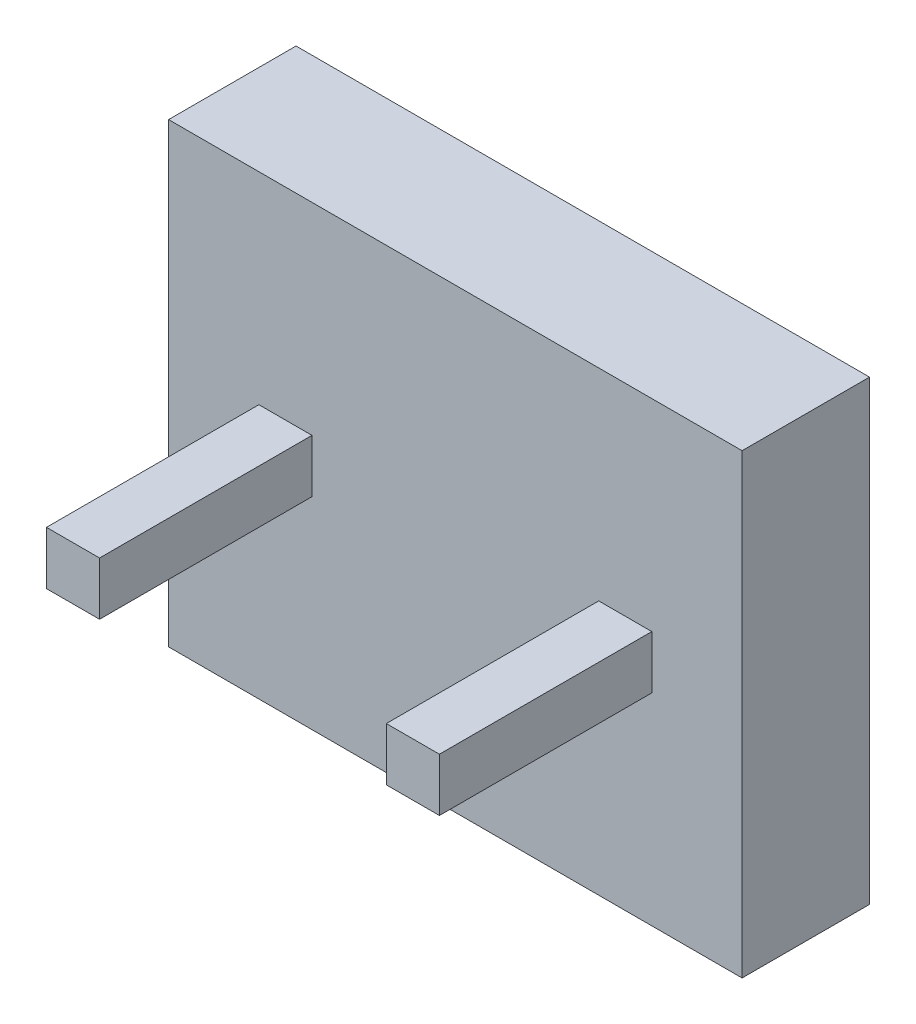
ISO-10303-21;
HEADER;
FILE_DESCRIPTION(('STEP AP214'),'2;1');
FILE_NAME('part.step','',(''),(''),'','','');
FILE_SCHEMA(('AUTOMOTIVE_DESIGN { 1 0 10303 214 1 1 1 1 }'));
ENDSEC;
DATA;
#1=APPLICATION_CONTEXT('core data for automotive mechanical design processes');
#2=APPLICATION_PROTOCOL_DEFINITION('international standard','automotive_design',2000,#1);
#3=PRODUCT_CONTEXT('',#1,'mechanical');
#4=PRODUCT('Part','Part','',(#3));
#5=PRODUCT_RELATED_PRODUCT_CATEGORY('part','',(#4));
#6=PRODUCT_DEFINITION_FORMATION('','',#4);
#7=PRODUCT_DEFINITION_CONTEXT('part definition',#1,'design');
#8=PRODUCT_DEFINITION('design','',#6,#7);
#9=PRODUCT_DEFINITION_SHAPE('','',#8);
#10=(LENGTH_UNIT() NAMED_UNIT(*) SI_UNIT(.MILLI.,.METRE.));
#11=(NAMED_UNIT(*) PLANE_ANGLE_UNIT() SI_UNIT($,.RADIAN.));
#12=(NAMED_UNIT(*) SI_UNIT($,.STERADIAN.) SOLID_ANGLE_UNIT());
#13=UNCERTAINTY_MEASURE_WITH_UNIT(LENGTH_MEASURE(1.E-05),#10,'distance_accuracy_value','');
#14=(GEOMETRIC_REPRESENTATION_CONTEXT(3) GLOBAL_UNCERTAINTY_ASSIGNED_CONTEXT((#13)) GLOBAL_UNIT_ASSIGNED_CONTEXT((#10,
#11,#12)) REPRESENTATION_CONTEXT('',''));
#15=CARTESIAN_POINT('',(0.,0.,0.));
#16=DIRECTION('',(0.,0.,1.));
#17=DIRECTION('',(1.,0.,0.));
#18=AXIS2_PLACEMENT_3D('',#15,#16,#17);
#19=CARTESIAN_POINT('',(-2.7,2.15,1.2));
#20=DIRECTION('',(1.,0.,0.));
#21=DIRECTION('',(0.,0.,-1.));
#22=AXIS2_PLACEMENT_3D('',#19,#20,#21);
#23=PLANE('',#22);
#24=DIRECTION('',(0.,-1.,0.));
#25=VECTOR('',#24,1.);
#26=CARTESIAN_POINT('',(-2.7,2.15,0.));
#27=LINE('',#26,#25);
#28=CARTESIAN_POINT('',(-2.7,2.15,0.));
#29=VERTEX_POINT('',#28);
#30=CARTESIAN_POINT('',(-2.7,-2.15,0.));
#31=VERTEX_POINT('',#30);
#32=EDGE_CURVE('E154',#29,#31,#27,.T.);
#33=ORIENTED_EDGE('',*,*,#32,.T.);
#34=DIRECTION('',(0.,0.,-1.));
#35=VECTOR('',#34,1.);
#36=CARTESIAN_POINT('',(-2.7,-2.15,1.2));
#37=LINE('',#36,#35);
#38=CARTESIAN_POINT('',(-2.7,-2.15,1.2));
#39=VERTEX_POINT('',#38);
#40=EDGE_CURVE('E11',#39,#31,#37,.T.);
#41=ORIENTED_EDGE('',*,*,#40,.F.);
#42=DIRECTION('',(0.,-1.,0.));
#43=VECTOR('',#42,1.);
#44=CARTESIAN_POINT('',(-2.7,2.15,1.2));
#45=LINE('',#44,#43);
#46=CARTESIAN_POINT('',(-2.7,2.15,1.2));
#47=VERTEX_POINT('',#46);
#48=EDGE_CURVE('E197',#47,#39,#45,.T.);
#49=ORIENTED_EDGE('',*,*,#48,.F.);
#50=DIRECTION('',(0.,0.,-1.));
#51=VECTOR('',#50,1.);
#52=CARTESIAN_POINT('',(-2.7,2.15,1.2));
#53=LINE('',#52,#51);
#54=EDGE_CURVE('E206',#47,#29,#53,.T.);
#55=ORIENTED_EDGE('',*,*,#54,.T.);
#56=EDGE_LOOP('',(#33,#41,#49,#55));
#57=FACE_BOUND('',#56,.T.);
#58=ADVANCED_FACE('F50',(#57),#23,.F.);
#59=CARTESIAN_POINT('',(-2.7,-2.15,1.2));
#60=DIRECTION('',(0.,1.,0.));
#61=DIRECTION('',(0.,0.,1.));
#62=AXIS2_PLACEMENT_3D('',#59,#60,#61);
#63=PLANE('',#62);
#64=DIRECTION('',(1.,0.,0.));
#65=VECTOR('',#64,1.);
#66=CARTESIAN_POINT('',(-2.7,-2.15,0.));
#67=LINE('',#66,#65);
#68=CARTESIAN_POINT('',(2.7,-2.15,0.));
#69=VERTEX_POINT('',#68);
#70=EDGE_CURVE('E158',#31,#69,#67,.T.);
#71=ORIENTED_EDGE('',*,*,#70,.T.);
#72=DIRECTION('',(0.,0.,-1.));
#73=VECTOR('',#72,1.);
#74=CARTESIAN_POINT('',(2.7,-2.15,1.2));
#75=LINE('',#74,#73);
#76=CARTESIAN_POINT('',(2.7,-2.15,1.2));
#77=VERTEX_POINT('',#76);
#78=EDGE_CURVE('E53',#77,#69,#75,.T.);
#79=ORIENTED_EDGE('',*,*,#78,.F.);
#80=DIRECTION('',(1.,0.,0.));
#81=VECTOR('',#80,1.);
#82=CARTESIAN_POINT('',(-2.7,-2.15,1.2));
#83=LINE('',#82,#81);
#84=EDGE_CURVE('E199',#39,#77,#83,.T.);
#85=ORIENTED_EDGE('',*,*,#84,.F.);
#86=ORIENTED_EDGE('',*,*,#40,.T.);
#87=EDGE_LOOP('',(#71,#79,#85,#86));
#88=FACE_BOUND('',#87,.T.);
#89=ADVANCED_FACE('F240',(#88),#63,.F.);
#90=CARTESIAN_POINT('',(2.7,-2.15,1.2));
#91=DIRECTION('',(-1.,0.,0.));
#92=DIRECTION('',(0.,0.,1.));
#93=AXIS2_PLACEMENT_3D('',#90,#91,#92);
#94=PLANE('',#93);
#95=DIRECTION('',(0.,1.,0.));
#96=VECTOR('',#95,1.);
#97=CARTESIAN_POINT('',(2.7,-2.15,0.));
#98=LINE('',#97,#96);
#99=CARTESIAN_POINT('',(2.7,2.15,0.));
#100=VERTEX_POINT('',#99);
#101=EDGE_CURVE('E207',#69,#100,#98,.T.);
#102=ORIENTED_EDGE('',*,*,#101,.T.);
#103=DIRECTION('',(0.,0.,-1.));
#104=VECTOR('',#103,1.);
#105=CARTESIAN_POINT('',(2.7,2.15,1.2));
#106=LINE('',#105,#104);
#107=CARTESIAN_POINT('',(2.7,2.15,1.2));
#108=VERTEX_POINT('',#107);
#109=EDGE_CURVE('E212',#108,#100,#106,.T.);
#110=ORIENTED_EDGE('',*,*,#109,.F.);
#111=DIRECTION('',(0.,1.,0.));
#112=VECTOR('',#111,1.);
#113=CARTESIAN_POINT('',(2.7,-2.15,1.2));
#114=LINE('',#113,#112);
#115=EDGE_CURVE('E201',#77,#108,#114,.T.);
#116=ORIENTED_EDGE('',*,*,#115,.F.);
#117=ORIENTED_EDGE('',*,*,#78,.T.);
#118=EDGE_LOOP('',(#102,#110,#116,#117));
#119=FACE_BOUND('',#118,.T.);
#120=ADVANCED_FACE('F222',(#119),#94,.F.);
#121=CARTESIAN_POINT('',(2.7,2.15,1.2));
#122=DIRECTION('',(0.,-1.,0.));
#123=DIRECTION('',(0.,0.,-1.));
#124=AXIS2_PLACEMENT_3D('',#121,#122,#123);
#125=PLANE('',#124);
#126=DIRECTION('',(-1.,0.,0.));
#127=VECTOR('',#126,1.);
#128=CARTESIAN_POINT('',(2.7,2.15,0.));
#129=LINE('',#128,#127);
#130=EDGE_CURVE('E203',#100,#29,#129,.T.);
#131=ORIENTED_EDGE('',*,*,#130,.T.);
#132=ORIENTED_EDGE('',*,*,#54,.F.);
#133=DIRECTION('',(-1.,0.,0.));
#134=VECTOR('',#133,1.);
#135=CARTESIAN_POINT('',(2.7,2.15,1.2));
#136=LINE('',#135,#134);
#137=EDGE_CURVE('E202',#108,#47,#136,.T.);
#138=ORIENTED_EDGE('',*,*,#137,.F.);
#139=ORIENTED_EDGE('',*,*,#109,.T.);
#140=EDGE_LOOP('',(#131,#132,#138,#139));
#141=FACE_BOUND('',#140,.T.);
#142=ADVANCED_FACE('F229',(#141),#125,.F.);
#143=CARTESIAN_POINT('',(0.,0.,1.2));
#144=DIRECTION('',(0.,0.,1.));
#145=DIRECTION('',(1.,0.,0.));
#146=AXIS2_PLACEMENT_3D('',#143,#144,#145);
#147=PLANE('',#146);
#148=DIRECTION('',(0.,-1.,0.));
#149=VECTOR('',#148,1.);
#150=CARTESIAN_POINT('',(-1.85,0.25,1.2));
#151=LINE('',#150,#149);
#152=CARTESIAN_POINT('',(-1.85,0.25,1.2));
#153=VERTEX_POINT('',#152);
#154=CARTESIAN_POINT('',(-1.85,-0.25,1.2));
#155=VERTEX_POINT('',#154);
#156=EDGE_CURVE('E61',#153,#155,#151,.T.);
#157=ORIENTED_EDGE('',*,*,#156,.F.);
#158=DIRECTION('',(-1.,0.,0.));
#159=VECTOR('',#158,1.);
#160=CARTESIAN_POINT('',(-1.35,0.25,1.2));
#161=LINE('',#160,#159);
#162=CARTESIAN_POINT('',(-1.35,0.25,1.2));
#163=VERTEX_POINT('',#162);
#164=EDGE_CURVE('E64',#163,#153,#161,.T.);
#165=ORIENTED_EDGE('',*,*,#164,.F.);
#166=DIRECTION('',(0.,1.,0.));
#167=VECTOR('',#166,1.);
#168=CARTESIAN_POINT('',(-1.35,-0.25,1.2));
#169=LINE('',#168,#167);
#170=CARTESIAN_POINT('',(-1.35,-0.25,1.2));
#171=VERTEX_POINT('',#170);
#172=EDGE_CURVE('E423',#171,#163,#169,.T.);
#173=ORIENTED_EDGE('',*,*,#172,.F.);
#174=DIRECTION('',(1.,0.,0.));
#175=VECTOR('',#174,1.);
#176=CARTESIAN_POINT('',(-1.85,-0.25,1.2));
#177=LINE('',#176,#175);
#178=EDGE_CURVE('E430',#155,#171,#177,.T.);
#179=ORIENTED_EDGE('',*,*,#178,.F.);
#180=EDGE_LOOP('',(#157,#165,#173,#179));
#181=FACE_BOUND('',#180,.T.);
#182=DIRECTION('',(0.,-1.,0.));
#183=VECTOR('',#182,1.);
#184=CARTESIAN_POINT('',(1.35,0.25,1.2));
#185=LINE('',#184,#183);
#186=CARTESIAN_POINT('',(1.35,0.25,1.2));
#187=VERTEX_POINT('',#186);
#188=CARTESIAN_POINT('',(1.35,-0.25,1.2));
#189=VERTEX_POINT('',#188);
#190=EDGE_CURVE('E190',#187,#189,#185,.T.);
#191=ORIENTED_EDGE('',*,*,#190,.F.);
#192=DIRECTION('',(-1.,0.,0.));
#193=VECTOR('',#192,1.);
#194=CARTESIAN_POINT('',(1.85,0.25,1.2));
#195=LINE('',#194,#193);
#196=CARTESIAN_POINT('',(1.85,0.25,1.2));
#197=VERTEX_POINT('',#196);
#198=EDGE_CURVE('E180',#197,#187,#195,.T.);
#199=ORIENTED_EDGE('',*,*,#198,.F.);
#200=DIRECTION('',(0.,1.,0.));
#201=VECTOR('',#200,1.);
#202=CARTESIAN_POINT('',(1.85,-0.25,1.2));
#203=LINE('',#202,#201);
#204=CARTESIAN_POINT('',(1.85,-0.25,1.2));
#205=VERTEX_POINT('',#204);
#206=EDGE_CURVE('E178',#205,#197,#203,.T.);
#207=ORIENTED_EDGE('',*,*,#206,.F.);
#208=DIRECTION('',(1.,0.,0.));
#209=VECTOR('',#208,1.);
#210=CARTESIAN_POINT('',(1.35,-0.25,1.2));
#211=LINE('',#210,#209);
#212=EDGE_CURVE('E184',#189,#205,#211,.T.);
#213=ORIENTED_EDGE('',*,*,#212,.F.);
#214=EDGE_LOOP('',(#191,#199,#207,#213));
#215=FACE_BOUND('',#214,.T.);
#216=ORIENTED_EDGE('',*,*,#48,.T.);
#217=ORIENTED_EDGE('',*,*,#84,.T.);
#218=ORIENTED_EDGE('',*,*,#115,.T.);
#219=ORIENTED_EDGE('',*,*,#137,.T.);
#220=EDGE_LOOP('',(#216,#217,#218,#219));
#221=FACE_BOUND('',#220,.T.);
#222=ADVANCED_FACE('F237',(#181,#215,#221),#147,.T.);
#223=CARTESIAN_POINT('',(0.,0.,0.));
#224=DIRECTION('',(0.,0.,1.));
#225=DIRECTION('',(1.,0.,0.));
#226=AXIS2_PLACEMENT_3D('',#223,#224,#225);
#227=PLANE('',#226);
#228=ORIENTED_EDGE('',*,*,#32,.F.);
#229=ORIENTED_EDGE('',*,*,#130,.F.);
#230=ORIENTED_EDGE('',*,*,#101,.F.);
#231=ORIENTED_EDGE('',*,*,#70,.F.);
#232=EDGE_LOOP('',(#228,#229,#230,#231));
#233=FACE_BOUND('',#232,.T.);
#234=ADVANCED_FACE('F230',(#233),#227,.F.);
#235=CARTESIAN_POINT('',(1.35,0.25,3.2));
#236=DIRECTION('',(1.,0.,0.));
#237=DIRECTION('',(0.,0.,-1.));
#238=AXIS2_PLACEMENT_3D('',#235,#236,#237);
#239=PLANE('',#238);
#240=ORIENTED_EDGE('',*,*,#190,.T.);
#241=DIRECTION('',(0.,0.,-1.));
#242=VECTOR('',#241,1.);
#243=CARTESIAN_POINT('',(1.35,-0.25,3.2));
#244=LINE('',#243,#242);
#245=CARTESIAN_POINT('',(1.35,-0.25,3.2));
#246=VERTEX_POINT('',#245);
#247=EDGE_CURVE('E163',#246,#189,#244,.T.);
#248=ORIENTED_EDGE('',*,*,#247,.F.);
#249=DIRECTION('',(0.,-1.,0.));
#250=VECTOR('',#249,1.);
#251=CARTESIAN_POINT('',(1.35,0.25,3.2));
#252=LINE('',#251,#250);
#253=CARTESIAN_POINT('',(1.35,0.25,3.2));
#254=VERTEX_POINT('',#253);
#255=EDGE_CURVE('E182',#254,#246,#252,.T.);
#256=ORIENTED_EDGE('',*,*,#255,.F.);
#257=DIRECTION('',(0.,0.,-1.));
#258=VECTOR('',#257,1.);
#259=CARTESIAN_POINT('',(1.35,0.25,3.2));
#260=LINE('',#259,#258);
#261=EDGE_CURVE('E172',#254,#187,#260,.T.);
#262=ORIENTED_EDGE('',*,*,#261,.T.);
#263=EDGE_LOOP('',(#240,#248,#256,#262));
#264=FACE_BOUND('',#263,.T.);
#265=ADVANCED_FACE('F246',(#264),#239,.F.);
#266=CARTESIAN_POINT('',(1.35,-0.25,3.2));
#267=DIRECTION('',(0.,1.,0.));
#268=DIRECTION('',(0.,0.,1.));
#269=AXIS2_PLACEMENT_3D('',#266,#267,#268);
#270=PLANE('',#269);
#271=ORIENTED_EDGE('',*,*,#212,.T.);
#272=DIRECTION('',(0.,0.,-1.));
#273=VECTOR('',#272,1.);
#274=CARTESIAN_POINT('',(1.85,-0.25,3.2));
#275=LINE('',#274,#273);
#276=CARTESIAN_POINT('',(1.85,-0.25,3.2));
#277=VERTEX_POINT('',#276);
#278=EDGE_CURVE('E170',#277,#205,#275,.T.);
#279=ORIENTED_EDGE('',*,*,#278,.F.);
#280=DIRECTION('',(1.,0.,0.));
#281=VECTOR('',#280,1.);
#282=CARTESIAN_POINT('',(1.35,-0.25,3.2));
#283=LINE('',#282,#281);
#284=EDGE_CURVE('E194',#246,#277,#283,.T.);
#285=ORIENTED_EDGE('',*,*,#284,.F.);
#286=ORIENTED_EDGE('',*,*,#247,.T.);
#287=EDGE_LOOP('',(#271,#279,#285,#286));
#288=FACE_BOUND('',#287,.T.);
#289=ADVANCED_FACE('F263',(#288),#270,.F.);
#290=CARTESIAN_POINT('',(1.85,-0.25,3.2));
#291=DIRECTION('',(-1.,0.,0.));
#292=DIRECTION('',(0.,0.,1.));
#293=AXIS2_PLACEMENT_3D('',#290,#291,#292);
#294=PLANE('',#293);
#295=ORIENTED_EDGE('',*,*,#206,.T.);
#296=DIRECTION('',(0.,0.,-1.));
#297=VECTOR('',#296,1.);
#298=CARTESIAN_POINT('',(1.85,0.25,3.2));
#299=LINE('',#298,#297);
#300=CARTESIAN_POINT('',(1.85,0.25,3.2));
#301=VERTEX_POINT('',#300);
#302=EDGE_CURVE('E168',#301,#197,#299,.T.);
#303=ORIENTED_EDGE('',*,*,#302,.F.);
#304=DIRECTION('',(0.,1.,0.));
#305=VECTOR('',#304,1.);
#306=CARTESIAN_POINT('',(1.85,-0.25,3.2));
#307=LINE('',#306,#305);
#308=EDGE_CURVE('E192',#277,#301,#307,.T.);
#309=ORIENTED_EDGE('',*,*,#308,.F.);
#310=ORIENTED_EDGE('',*,*,#278,.T.);
#311=EDGE_LOOP('',(#295,#303,#309,#310));
#312=FACE_BOUND('',#311,.T.);
#313=ADVANCED_FACE('F259',(#312),#294,.F.);
#314=CARTESIAN_POINT('',(1.85,0.25,3.2));
#315=DIRECTION('',(0.,-1.,0.));
#316=DIRECTION('',(0.,0.,-1.));
#317=AXIS2_PLACEMENT_3D('',#314,#315,#316);
#318=PLANE('',#317);
#319=ORIENTED_EDGE('',*,*,#198,.T.);
#320=ORIENTED_EDGE('',*,*,#261,.F.);
#321=DIRECTION('',(-1.,0.,0.));
#322=VECTOR('',#321,1.);
#323=CARTESIAN_POINT('',(1.85,0.25,3.2));
#324=LINE('',#323,#322);
#325=EDGE_CURVE('E177',#301,#254,#324,.T.);
#326=ORIENTED_EDGE('',*,*,#325,.F.);
#327=ORIENTED_EDGE('',*,*,#302,.T.);
#328=EDGE_LOOP('',(#319,#320,#326,#327));
#329=FACE_BOUND('',#328,.T.);
#330=ADVANCED_FACE('F254',(#329),#318,.F.);
#331=CARTESIAN_POINT('',(0.,0.,3.2));
#332=DIRECTION('',(0.,0.,1.));
#333=DIRECTION('',(1.,0.,0.));
#334=AXIS2_PLACEMENT_3D('',#331,#332,#333);
#335=PLANE('',#334);
#336=ORIENTED_EDGE('',*,*,#255,.T.);
#337=ORIENTED_EDGE('',*,*,#284,.T.);
#338=ORIENTED_EDGE('',*,*,#308,.T.);
#339=ORIENTED_EDGE('',*,*,#325,.T.);
#340=EDGE_LOOP('',(#336,#337,#338,#339));
#341=FACE_BOUND('',#340,.T.);
#342=ADVANCED_FACE('F252',(#341),#335,.T.);
#343=CARTESIAN_POINT('',(-1.85,0.25,3.2));
#344=DIRECTION('',(1.,0.,0.));
#345=DIRECTION('',(0.,0.,-1.));
#346=AXIS2_PLACEMENT_3D('',#343,#344,#345);
#347=PLANE('',#346);
#348=ORIENTED_EDGE('',*,*,#156,.T.);
#349=DIRECTION('',(0.,0.,-1.));
#350=VECTOR('',#349,1.);
#351=CARTESIAN_POINT('',(-1.85,-0.25,3.2));
#352=LINE('',#351,#350);
#353=CARTESIAN_POINT('',(-1.85,-0.25,3.2));
#354=VERTEX_POINT('',#353);
#355=EDGE_CURVE('E139',#354,#155,#352,.T.);
#356=ORIENTED_EDGE('',*,*,#355,.F.);
#357=DIRECTION('',(0.,-1.,0.));
#358=VECTOR('',#357,1.);
#359=CARTESIAN_POINT('',(-1.85,0.25,3.2));
#360=LINE('',#359,#358);
#361=CARTESIAN_POINT('',(-1.85,0.25,3.2));
#362=VERTEX_POINT('',#361);
#363=EDGE_CURVE('E145',#362,#354,#360,.T.);
#364=ORIENTED_EDGE('',*,*,#363,.F.);
#365=DIRECTION('',(0.,0.,-1.));
#366=VECTOR('',#365,1.);
#367=CARTESIAN_POINT('',(-1.85,0.25,3.2));
#368=LINE('',#367,#366);
#369=EDGE_CURVE('E420',#362,#153,#368,.T.);
#370=ORIENTED_EDGE('',*,*,#369,.T.);
#371=EDGE_LOOP('',(#348,#356,#364,#370));
#372=FACE_BOUND('',#371,.T.);
#373=ADVANCED_FACE('F152',(#372),#347,.F.);
#374=CARTESIAN_POINT('',(-1.85,-0.25,3.2));
#375=DIRECTION('',(0.,1.,0.));
#376=DIRECTION('',(0.,0.,1.));
#377=AXIS2_PLACEMENT_3D('',#374,#375,#376);
#378=PLANE('',#377);
#379=ORIENTED_EDGE('',*,*,#178,.T.);
#380=DIRECTION('',(0.,0.,-1.));
#381=VECTOR('',#380,1.);
#382=CARTESIAN_POINT('',(-1.35,-0.25,3.2));
#383=LINE('',#382,#381);
#384=CARTESIAN_POINT('',(-1.35,-0.25,3.2));
#385=VERTEX_POINT('',#384);
#386=EDGE_CURVE('E138',#385,#171,#383,.T.);
#387=ORIENTED_EDGE('',*,*,#386,.F.);
#388=DIRECTION('',(1.,0.,0.));
#389=VECTOR('',#388,1.);
#390=CARTESIAN_POINT('',(-1.85,-0.25,3.2));
#391=LINE('',#390,#389);
#392=EDGE_CURVE('E132',#354,#385,#391,.T.);
#393=ORIENTED_EDGE('',*,*,#392,.F.);
#394=ORIENTED_EDGE('',*,*,#355,.T.);
#395=EDGE_LOOP('',(#379,#387,#393,#394));
#396=FACE_BOUND('',#395,.T.);
#397=ADVANCED_FACE('F137',(#396),#378,.F.);
#398=CARTESIAN_POINT('',(-1.35,-0.25,3.2));
#399=DIRECTION('',(-1.,0.,0.));
#400=DIRECTION('',(0.,0.,1.));
#401=AXIS2_PLACEMENT_3D('',#398,#399,#400);
#402=PLANE('',#401);
#403=ORIENTED_EDGE('',*,*,#172,.T.);
#404=DIRECTION('',(0.,0.,-1.));
#405=VECTOR('',#404,1.);
#406=CARTESIAN_POINT('',(-1.35,0.25,3.2));
#407=LINE('',#406,#405);
#408=CARTESIAN_POINT('',(-1.35,0.25,3.2));
#409=VERTEX_POINT('',#408);
#410=EDGE_CURVE('E159',#409,#163,#407,.T.);
#411=ORIENTED_EDGE('',*,*,#410,.F.);
#412=DIRECTION('',(0.,1.,0.));
#413=VECTOR('',#412,1.);
#414=CARTESIAN_POINT('',(-1.35,-0.25,3.2));
#415=LINE('',#414,#413);
#416=EDGE_CURVE('E141',#385,#409,#415,.T.);
#417=ORIENTED_EDGE('',*,*,#416,.F.);
#418=ORIENTED_EDGE('',*,*,#386,.T.);
#419=EDGE_LOOP('',(#403,#411,#417,#418));
#420=FACE_BOUND('',#419,.T.);
#421=ADVANCED_FACE('F274',(#420),#402,.F.);
#422=CARTESIAN_POINT('',(-1.35,0.25,3.2));
#423=DIRECTION('',(0.,-1.,0.));
#424=DIRECTION('',(0.,0.,-1.));
#425=AXIS2_PLACEMENT_3D('',#422,#423,#424);
#426=PLANE('',#425);
#427=ORIENTED_EDGE('',*,*,#164,.T.);
#428=ORIENTED_EDGE('',*,*,#369,.F.);
#429=DIRECTION('',(-1.,0.,0.));
#430=VECTOR('',#429,1.);
#431=CARTESIAN_POINT('',(-1.35,0.25,3.2));
#432=LINE('',#431,#430);
#433=EDGE_CURVE('E149',#409,#362,#432,.T.);
#434=ORIENTED_EDGE('',*,*,#433,.F.);
#435=ORIENTED_EDGE('',*,*,#410,.T.);
#436=EDGE_LOOP('',(#427,#428,#434,#435));
#437=FACE_BOUND('',#436,.T.);
#438=ADVANCED_FACE('F279',(#437),#426,.F.);
#439=CARTESIAN_POINT('',(0.,0.,3.2));
#440=DIRECTION('',(0.,0.,1.));
#441=DIRECTION('',(1.,0.,0.));
#442=AXIS2_PLACEMENT_3D('',#439,#440,#441);
#443=PLANE('',#442);
#444=ORIENTED_EDGE('',*,*,#363,.T.);
#445=ORIENTED_EDGE('',*,*,#392,.T.);
#446=ORIENTED_EDGE('',*,*,#416,.T.);
#447=ORIENTED_EDGE('',*,*,#433,.T.);
#448=EDGE_LOOP('',(#444,#445,#446,#447));
#449=FACE_BOUND('',#448,.T.);
#450=ADVANCED_FACE('F150',(#449),#443,.T.);
#451=CLOSED_SHELL('',(#58,#89,#120,#142,#222,#234,#265,#289,#313,#330,#342,#373,#397,#421,#438,#450));
#452=MANIFOLD_SOLID_BREP('B2',#451);
#453=ADVANCED_BREP_SHAPE_REPRESENTATION('',(#18,#452),#14);
#454=SHAPE_DEFINITION_REPRESENTATION(#9,#453);
ENDSEC;
END-ISO-10303-21;
